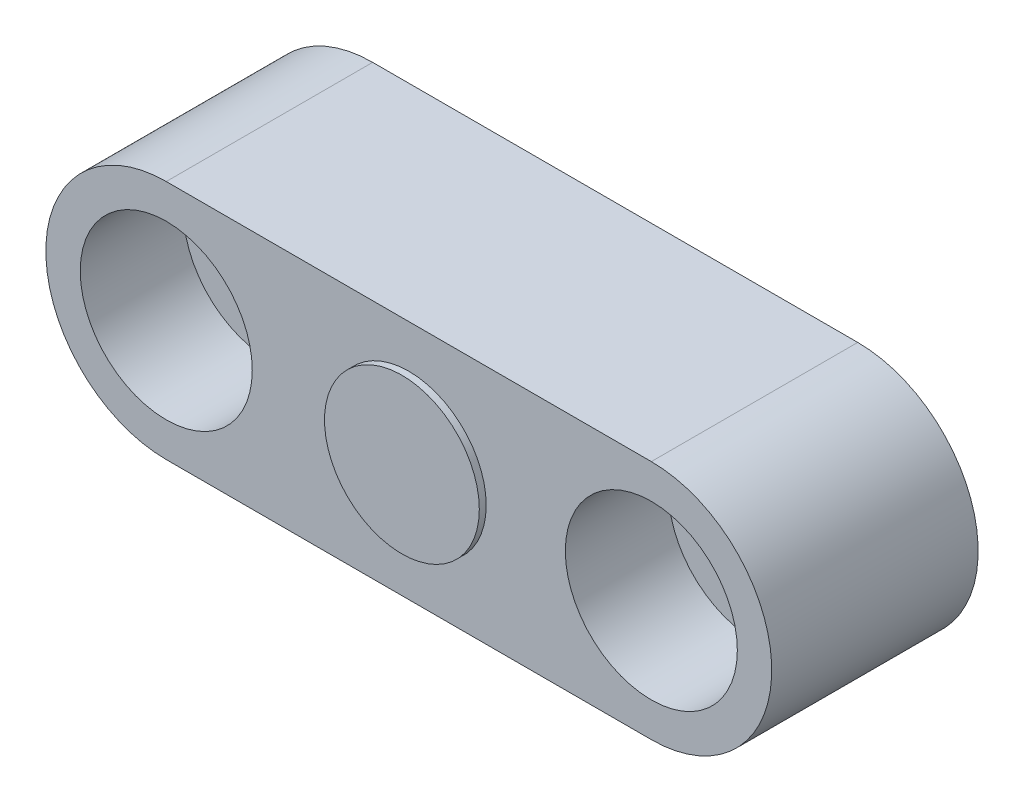
ISO-10303-21;
HEADER;
FILE_DESCRIPTION(('STEP AP214'),'2;1');
FILE_NAME('part.step','',(''),(''),'','','');
FILE_SCHEMA(('AUTOMOTIVE_DESIGN { 1 0 10303 214 1 1 1 1 }'));
ENDSEC;
DATA;
#1=APPLICATION_CONTEXT('core data for automotive mechanical design processes');
#2=APPLICATION_PROTOCOL_DEFINITION('international standard','automotive_design',2000,#1);
#3=PRODUCT_CONTEXT('',#1,'mechanical');
#4=PRODUCT('Part','Part','',(#3));
#5=PRODUCT_RELATED_PRODUCT_CATEGORY('part','',(#4));
#6=PRODUCT_DEFINITION_FORMATION('','',#4);
#7=PRODUCT_DEFINITION_CONTEXT('part definition',#1,'design');
#8=PRODUCT_DEFINITION('design','',#6,#7);
#9=PRODUCT_DEFINITION_SHAPE('','',#8);
#10=(LENGTH_UNIT() NAMED_UNIT(*) SI_UNIT(.MILLI.,.METRE.));
#11=(NAMED_UNIT(*) PLANE_ANGLE_UNIT() SI_UNIT($,.RADIAN.));
#12=(NAMED_UNIT(*) SI_UNIT($,.STERADIAN.) SOLID_ANGLE_UNIT());
#13=UNCERTAINTY_MEASURE_WITH_UNIT(LENGTH_MEASURE(1.E-05),#10,'distance_accuracy_value','');
#14=(GEOMETRIC_REPRESENTATION_CONTEXT(3) GLOBAL_UNCERTAINTY_ASSIGNED_CONTEXT((#13)) GLOBAL_UNIT_ASSIGNED_CONTEXT((#10,
#11,#12)) REPRESENTATION_CONTEXT('',''));
#15=CARTESIAN_POINT('',(0.,0.,0.));
#16=DIRECTION('',(0.,0.,1.));
#17=DIRECTION('',(1.,0.,0.));
#18=AXIS2_PLACEMENT_3D('',#15,#16,#17);
#19=CARTESIAN_POINT('',(7.05,0.,0.));
#20=DIRECTION('',(0.,0.,-1.));
#21=DIRECTION('',(-1.,0.,0.));
#22=AXIS2_PLACEMENT_3D('',#19,#20,#21);
#23=PLANE('',#22);
#24=CARTESIAN_POINT('',(-7.05,0.,0.));
#25=DIRECTION('',(0.,0.,1.));
#26=DIRECTION('',(-1.,0.,0.));
#27=AXIS2_PLACEMENT_3D('',#24,#25,#26);
#28=CIRCLE('',#27,3.17759916969509);
#29=CARTESIAN_POINT('',(-5.45794582904759,-2.75,0.));
#30=VERTEX_POINT('',#29);
#31=CARTESIAN_POINT('',(-5.45794582904759,2.75,0.));
#32=VERTEX_POINT('',#31);
#33=EDGE_CURVE('E51',#30,#32,#28,.T.);
#34=ORIENTED_EDGE('',*,*,#33,.F.);
#35=DIRECTION('',(-1.,0.,0.));
#36=VECTOR('',#35,1.);
#37=CARTESIAN_POINT('',(5.45794582904759,-2.75,0.));
#38=LINE('',#37,#36);
#39=CARTESIAN_POINT('',(5.45794582904759,-2.75,0.));
#40=VERTEX_POINT('',#39);
#41=EDGE_CURVE('E133',#40,#30,#38,.T.);
#42=ORIENTED_EDGE('',*,*,#41,.F.);
#43=CARTESIAN_POINT('',(7.05,0.,0.));
#44=DIRECTION('',(0.,0.,1.));
#45=DIRECTION('',(1.,0.,0.));
#46=AXIS2_PLACEMENT_3D('',#43,#44,#45);
#47=CIRCLE('',#46,3.17759916969509);
#48=CARTESIAN_POINT('',(5.45794582904759,2.75,0.));
#49=VERTEX_POINT('',#48);
#50=EDGE_CURVE('E117',#49,#40,#47,.T.);
#51=ORIENTED_EDGE('',*,*,#50,.F.);
#52=DIRECTION('',(1.,0.,0.));
#53=VECTOR('',#52,1.);
#54=CARTESIAN_POINT('',(5.45794582904759,2.75,0.));
#55=LINE('',#54,#53);
#56=EDGE_CURVE('E127',#32,#49,#55,.T.);
#57=ORIENTED_EDGE('',*,*,#56,.F.);
#58=EDGE_LOOP('',(#34,#42,#51,#57));
#59=FACE_BOUND('',#58,.T.);
#60=CARTESIAN_POINT('',(7.05,0.,0.));
#61=DIRECTION('',(0.,0.,1.));
#62=DIRECTION('',(-1.,0.,0.));
#63=AXIS2_PLACEMENT_3D('',#60,#61,#62);
#64=CIRCLE('',#63,3.49999999999994);
#65=CARTESIAN_POINT('',(7.05,-3.49999999999991,0.));
#66=VERTEX_POINT('',#65);
#67=CARTESIAN_POINT('',(7.05,3.49999999999998,0.));
#68=VERTEX_POINT('',#67);
#69=EDGE_CURVE('E179',#66,#68,#64,.T.);
#70=ORIENTED_EDGE('',*,*,#69,.F.);
#71=DIRECTION('',(1.,0.,0.));
#72=VECTOR('',#71,1.);
#73=CARTESIAN_POINT('',(7.05,-3.49999999999991,0.));
#74=LINE('',#73,#72);
#75=CARTESIAN_POINT('',(-7.05,-3.49999999999991,0.));
#76=VERTEX_POINT('',#75);
#77=EDGE_CURVE('E81',#76,#66,#74,.T.);
#78=ORIENTED_EDGE('',*,*,#77,.F.);
#79=CARTESIAN_POINT('',(-7.05,0.,0.));
#80=DIRECTION('',(0.,0.,1.));
#81=DIRECTION('',(1.,0.,0.));
#82=AXIS2_PLACEMENT_3D('',#79,#80,#81);
#83=CIRCLE('',#82,3.49999999999994);
#84=CARTESIAN_POINT('',(-7.05,3.49999999999994,0.));
#85=VERTEX_POINT('',#84);
#86=EDGE_CURVE('E193',#85,#76,#83,.T.);
#87=ORIENTED_EDGE('',*,*,#86,.F.);
#88=DIRECTION('',(-1.,0.,0.));
#89=VECTOR('',#88,1.);
#90=CARTESIAN_POINT('',(-7.05,3.49999999999998,0.));
#91=LINE('',#90,#89);
#92=EDGE_CURVE('E191',#68,#85,#91,.T.);
#93=ORIENTED_EDGE('',*,*,#92,.F.);
#94=EDGE_LOOP('',(#70,#78,#87,#93));
#95=FACE_BOUND('',#94,.T.);
#96=CARTESIAN_POINT('',(7.05,0.,0.));
#97=DIRECTION('',(0.,0.,-1.));
#98=DIRECTION('',(-1.,0.,0.));
#99=AXIS2_PLACEMENT_3D('',#96,#97,#98);
#100=CIRCLE('',#99,2.5);
#101=CARTESIAN_POINT('',(4.55,0.,0.));
#102=VERTEX_POINT('',#101);
#103=EDGE_CURVE('E166',#102,#102,#100,.T.);
#104=ORIENTED_EDGE('',*,*,#103,.F.);
#105=EDGE_LOOP('',(#104));
#106=FACE_BOUND('',#105,.T.);
#107=CARTESIAN_POINT('',(-7.05,0.,0.));
#108=DIRECTION('',(0.,0.,1.));
#109=DIRECTION('',(1.,0.,0.));
#110=AXIS2_PLACEMENT_3D('',#107,#108,#109);
#111=CIRCLE('',#110,2.5);
#112=CARTESIAN_POINT('',(-4.55,0.,0.));
#113=VERTEX_POINT('',#112);
#114=EDGE_CURVE('E148',#113,#113,#111,.T.);
#115=ORIENTED_EDGE('',*,*,#114,.T.);
#116=EDGE_LOOP('',(#115));
#117=FACE_BOUND('',#116,.T.);
#118=ADVANCED_FACE('F36',(#59,#95,#106,#117),#23,.T.);
#119=CARTESIAN_POINT('',(-7.05,0.,0.));
#120=DIRECTION('',(0.,0.,1.));
#121=DIRECTION('',(1.,0.,0.));
#122=AXIS2_PLACEMENT_3D('',#119,#120,#121);
#123=CYLINDRICAL_SURFACE('',#122,1.75);
#124=CARTESIAN_POINT('',(-7.05,0.,3.));
#125=DIRECTION('',(0.,0.,-1.));
#126=DIRECTION('',(-1.,0.,0.));
#127=AXIS2_PLACEMENT_3D('',#124,#125,#126);
#128=CIRCLE('',#127,1.75);
#129=CARTESIAN_POINT('',(-8.8,0.,3.));
#130=VERTEX_POINT('',#129);
#131=EDGE_CURVE('E152',#130,#130,#128,.T.);
#132=ORIENTED_EDGE('',*,*,#131,.F.);
#133=EDGE_LOOP('',(#132));
#134=FACE_BOUND('',#133,.T.);
#135=CARTESIAN_POINT('',(-7.05,0.,2.));
#136=DIRECTION('',(0.,0.,1.));
#137=DIRECTION('',(1.,0.,0.));
#138=AXIS2_PLACEMENT_3D('',#135,#136,#137);
#139=CIRCLE('',#138,1.75);
#140=CARTESIAN_POINT('',(-5.3,0.,2.));
#141=VERTEX_POINT('',#140);
#142=EDGE_CURVE('E144',#141,#141,#139,.T.);
#143=ORIENTED_EDGE('',*,*,#142,.F.);
#144=EDGE_LOOP('',(#143));
#145=FACE_BOUND('',#144,.T.);
#146=ADVANCED_FACE('F230',(#134,#145),#123,.F.);
#147=CARTESIAN_POINT('',(7.05,0.,0.));
#148=DIRECTION('',(0.,0.,1.));
#149=DIRECTION('',(1.,0.,0.));
#150=AXIS2_PLACEMENT_3D('',#147,#148,#149);
#151=CYLINDRICAL_SURFACE('',#150,1.75);
#152=CARTESIAN_POINT('',(7.05,0.,3.));
#153=DIRECTION('',(0.,0.,1.));
#154=DIRECTION('',(1.,0.,0.));
#155=AXIS2_PLACEMENT_3D('',#152,#153,#154);
#156=CIRCLE('',#155,1.75);
#157=CARTESIAN_POINT('',(8.8,0.,3.));
#158=VERTEX_POINT('',#157);
#159=EDGE_CURVE('E170',#158,#158,#156,.T.);
#160=ORIENTED_EDGE('',*,*,#159,.T.);
#161=EDGE_LOOP('',(#160));
#162=FACE_BOUND('',#161,.T.);
#163=CARTESIAN_POINT('',(7.05,0.,2.));
#164=DIRECTION('',(0.,0.,-1.));
#165=DIRECTION('',(-1.,0.,0.));
#166=AXIS2_PLACEMENT_3D('',#163,#164,#165);
#167=CIRCLE('',#166,1.75);
#168=CARTESIAN_POINT('',(5.3,0.,2.));
#169=VERTEX_POINT('',#168);
#170=EDGE_CURVE('E161',#169,#169,#167,.T.);
#171=ORIENTED_EDGE('',*,*,#170,.T.);
#172=EDGE_LOOP('',(#171));
#173=FACE_BOUND('',#172,.T.);
#174=ADVANCED_FACE('F234',(#162,#173),#151,.F.);
#175=CARTESIAN_POINT('',(7.05,0.,6.));
#176=DIRECTION('',(0.,0.,-1.));
#177=DIRECTION('',(-1.,0.,0.));
#178=AXIS2_PLACEMENT_3D('',#175,#176,#177);
#179=CYLINDRICAL_SURFACE('',#178,3.49999999999994);
#180=ORIENTED_EDGE('',*,*,#69,.T.);
#181=DIRECTION('',(0.,0.,-1.));
#182=VECTOR('',#181,1.);
#183=CARTESIAN_POINT('',(7.05,3.49999999999998,6.));
#184=LINE('',#183,#182);
#185=CARTESIAN_POINT('',(7.05,3.49999999999998,6.));
#186=VERTEX_POINT('',#185);
#187=EDGE_CURVE('E44',#186,#68,#184,.T.);
#188=ORIENTED_EDGE('',*,*,#187,.F.);
#189=CARTESIAN_POINT('',(7.05,0.,6.));
#190=DIRECTION('',(0.,0.,1.));
#191=DIRECTION('',(-1.,0.,0.));
#192=AXIS2_PLACEMENT_3D('',#189,#190,#191);
#193=CIRCLE('',#192,3.49999999999994);
#194=CARTESIAN_POINT('',(7.05,-3.49999999999991,6.));
#195=VERTEX_POINT('',#194);
#196=EDGE_CURVE('E182',#195,#186,#193,.T.);
#197=ORIENTED_EDGE('',*,*,#196,.F.);
#198=DIRECTION('',(0.,0.,-1.));
#199=VECTOR('',#198,1.);
#200=CARTESIAN_POINT('',(7.05,-3.49999999999991,6.));
#201=LINE('',#200,#199);
#202=EDGE_CURVE('E188',#195,#66,#201,.T.);
#203=ORIENTED_EDGE('',*,*,#202,.T.);
#204=EDGE_LOOP('',(#180,#188,#197,#203));
#205=FACE_BOUND('',#204,.T.);
#206=ADVANCED_FACE('F38',(#205),#179,.T.);
#207=CARTESIAN_POINT('',(-7.05,3.49999999999998,6.));
#208=DIRECTION('',(0.,-1.,0.));
#209=DIRECTION('',(0.,0.,-1.));
#210=AXIS2_PLACEMENT_3D('',#207,#208,#209);
#211=PLANE('',#210);
#212=ORIENTED_EDGE('',*,*,#92,.T.);
#213=DIRECTION('',(0.,0.,-1.));
#214=VECTOR('',#213,1.);
#215=CARTESIAN_POINT('',(-7.05,3.49999999999994,6.));
#216=LINE('',#215,#214);
#217=CARTESIAN_POINT('',(-7.05,3.49999999999994,6.));
#218=VERTEX_POINT('',#217);
#219=EDGE_CURVE('E199',#218,#85,#216,.T.);
#220=ORIENTED_EDGE('',*,*,#219,.F.);
#221=DIRECTION('',(-1.,0.,0.));
#222=VECTOR('',#221,1.);
#223=CARTESIAN_POINT('',(-7.05,3.49999999999998,6.));
#224=LINE('',#223,#222);
#225=EDGE_CURVE('E89',#186,#218,#224,.T.);
#226=ORIENTED_EDGE('',*,*,#225,.F.);
#227=ORIENTED_EDGE('',*,*,#187,.T.);
#228=EDGE_LOOP('',(#212,#220,#226,#227));
#229=FACE_BOUND('',#228,.T.);
#230=ADVANCED_FACE('F202',(#229),#211,.F.);
#231=CARTESIAN_POINT('',(-7.05,0.,6.));
#232=DIRECTION('',(0.,0.,-1.));
#233=DIRECTION('',(-1.,0.,0.));
#234=AXIS2_PLACEMENT_3D('',#231,#232,#233);
#235=CYLINDRICAL_SURFACE('',#234,3.49999999999994);
#236=ORIENTED_EDGE('',*,*,#86,.T.);
#237=DIRECTION('',(0.,0.,-1.));
#238=VECTOR('',#237,1.);
#239=CARTESIAN_POINT('',(-7.05,-3.49999999999991,6.));
#240=LINE('',#239,#238);
#241=CARTESIAN_POINT('',(-7.05,-3.49999999999991,6.));
#242=VERTEX_POINT('',#241);
#243=EDGE_CURVE('E197',#242,#76,#240,.T.);
#244=ORIENTED_EDGE('',*,*,#243,.F.);
#245=CARTESIAN_POINT('',(-7.05,0.,6.));
#246=DIRECTION('',(0.,0.,1.));
#247=DIRECTION('',(1.,0.,0.));
#248=AXIS2_PLACEMENT_3D('',#245,#246,#247);
#249=CIRCLE('',#248,3.49999999999994);
#250=EDGE_CURVE('E185',#218,#242,#249,.T.);
#251=ORIENTED_EDGE('',*,*,#250,.F.);
#252=ORIENTED_EDGE('',*,*,#219,.T.);
#253=EDGE_LOOP('',(#236,#244,#251,#252));
#254=FACE_BOUND('',#253,.T.);
#255=ADVANCED_FACE('F210',(#254),#235,.T.);
#256=CARTESIAN_POINT('',(7.05,-3.49999999999991,6.));
#257=DIRECTION('',(0.,1.,0.));
#258=DIRECTION('',(0.,0.,1.));
#259=AXIS2_PLACEMENT_3D('',#256,#257,#258);
#260=PLANE('',#259);
#261=ORIENTED_EDGE('',*,*,#77,.T.);
#262=ORIENTED_EDGE('',*,*,#202,.F.);
#263=DIRECTION('',(1.,0.,0.));
#264=VECTOR('',#263,1.);
#265=CARTESIAN_POINT('',(7.05,-3.49999999999991,6.));
#266=LINE('',#265,#264);
#267=EDGE_CURVE('E60',#242,#195,#266,.T.);
#268=ORIENTED_EDGE('',*,*,#267,.F.);
#269=ORIENTED_EDGE('',*,*,#243,.T.);
#270=EDGE_LOOP('',(#261,#262,#268,#269));
#271=FACE_BOUND('',#270,.T.);
#272=ADVANCED_FACE('F212',(#271),#260,.F.);
#273=CARTESIAN_POINT('',(7.05,0.,6.));
#274=DIRECTION('',(0.,0.,-1.));
#275=DIRECTION('',(-1.,0.,0.));
#276=AXIS2_PLACEMENT_3D('',#273,#274,#275);
#277=PLANE('',#276);
#278=CARTESIAN_POINT('',(0.,0.,6.));
#279=DIRECTION('',(0.,0.,-1.));
#280=DIRECTION('',(-1.,0.,0.));
#281=AXIS2_PLACEMENT_3D('',#278,#279,#280);
#282=CIRCLE('',#281,2.25);
#283=CARTESIAN_POINT('',(-2.25,0.,6.));
#284=VERTEX_POINT('',#283);
#285=EDGE_CURVE('E422',#284,#284,#282,.T.);
#286=ORIENTED_EDGE('',*,*,#285,.T.);
#287=EDGE_LOOP('',(#286));
#288=FACE_BOUND('',#287,.T.);
#289=CARTESIAN_POINT('',(-7.05,0.,6.));
#290=DIRECTION('',(0.,0.,-1.));
#291=DIRECTION('',(-1.,0.,0.));
#292=AXIS2_PLACEMENT_3D('',#289,#290,#291);
#293=CIRCLE('',#292,2.5);
#294=CARTESIAN_POINT('',(-9.55,0.,6.));
#295=VERTEX_POINT('',#294);
#296=EDGE_CURVE('E157',#295,#295,#293,.T.);
#297=ORIENTED_EDGE('',*,*,#296,.T.);
#298=EDGE_LOOP('',(#297));
#299=FACE_BOUND('',#298,.T.);
#300=CARTESIAN_POINT('',(7.05,0.,6.));
#301=DIRECTION('',(0.,0.,1.));
#302=DIRECTION('',(1.,0.,0.));
#303=AXIS2_PLACEMENT_3D('',#300,#301,#302);
#304=CIRCLE('',#303,2.5);
#305=CARTESIAN_POINT('',(9.55,0.,6.));
#306=VERTEX_POINT('',#305);
#307=EDGE_CURVE('E175',#306,#306,#304,.T.);
#308=ORIENTED_EDGE('',*,*,#307,.F.);
#309=EDGE_LOOP('',(#308));
#310=FACE_BOUND('',#309,.T.);
#311=ORIENTED_EDGE('',*,*,#196,.T.);
#312=ORIENTED_EDGE('',*,*,#225,.T.);
#313=ORIENTED_EDGE('',*,*,#250,.T.);
#314=ORIENTED_EDGE('',*,*,#267,.T.);
#315=EDGE_LOOP('',(#311,#312,#313,#314));
#316=FACE_BOUND('',#315,.T.);
#317=ADVANCED_FACE('F213',(#288,#299,#310,#316),#277,.F.);
#318=CARTESIAN_POINT('',(7.05,0.,3.));
#319=DIRECTION('',(0.,0.,1.));
#320=DIRECTION('',(1.,0.,0.));
#321=AXIS2_PLACEMENT_3D('',#318,#319,#320);
#322=CYLINDRICAL_SURFACE('',#321,2.5);
#323=CARTESIAN_POINT('',(7.05,0.,3.));
#324=DIRECTION('',(0.,0.,1.));
#325=DIRECTION('',(1.,0.,0.));
#326=AXIS2_PLACEMENT_3D('',#323,#324,#325);
#327=CIRCLE('',#326,2.5);
#328=CARTESIAN_POINT('',(9.55,0.,3.));
#329=VERTEX_POINT('',#328);
#330=EDGE_CURVE('E176',#329,#329,#327,.T.);
#331=ORIENTED_EDGE('',*,*,#330,.F.);
#332=EDGE_LOOP('',(#331));
#333=FACE_BOUND('',#332,.T.);
#334=ORIENTED_EDGE('',*,*,#307,.T.);
#335=EDGE_LOOP('',(#334));
#336=FACE_BOUND('',#335,.T.);
#337=ADVANCED_FACE('F215',(#333,#336),#322,.F.);
#338=CARTESIAN_POINT('',(7.05,0.,3.));
#339=DIRECTION('',(0.,0.,1.));
#340=DIRECTION('',(1.,0.,0.));
#341=AXIS2_PLACEMENT_3D('',#338,#339,#340);
#342=PLANE('',#341);
#343=ORIENTED_EDGE('',*,*,#159,.F.);
#344=EDGE_LOOP('',(#343));
#345=FACE_BOUND('',#344,.T.);
#346=ORIENTED_EDGE('',*,*,#330,.T.);
#347=EDGE_LOOP('',(#346));
#348=FACE_BOUND('',#347,.T.);
#349=ADVANCED_FACE('F222',(#345,#348),#342,.T.);
#350=CARTESIAN_POINT('',(7.05,0.,2.));
#351=DIRECTION('',(0.,0.,-1.));
#352=DIRECTION('',(-1.,0.,0.));
#353=AXIS2_PLACEMENT_3D('',#350,#351,#352);
#354=CYLINDRICAL_SURFACE('',#353,2.5);
#355=CARTESIAN_POINT('',(7.05,0.,2.));
#356=DIRECTION('',(0.,0.,-1.));
#357=DIRECTION('',(-1.,0.,0.));
#358=AXIS2_PLACEMENT_3D('',#355,#356,#357);
#359=CIRCLE('',#358,2.5);
#360=CARTESIAN_POINT('',(4.55,0.,2.));
#361=VERTEX_POINT('',#360);
#362=EDGE_CURVE('E167',#361,#361,#359,.T.);
#363=ORIENTED_EDGE('',*,*,#362,.F.);
#364=EDGE_LOOP('',(#363));
#365=FACE_BOUND('',#364,.T.);
#366=ORIENTED_EDGE('',*,*,#103,.T.);
#367=EDGE_LOOP('',(#366));
#368=FACE_BOUND('',#367,.T.);
#369=ADVANCED_FACE('F253',(#365,#368),#354,.F.);
#370=CARTESIAN_POINT('',(7.05,0.,2.));
#371=DIRECTION('',(0.,0.,-1.));
#372=DIRECTION('',(-1.,0.,0.));
#373=AXIS2_PLACEMENT_3D('',#370,#371,#372);
#374=PLANE('',#373);
#375=ORIENTED_EDGE('',*,*,#170,.F.);
#376=EDGE_LOOP('',(#375));
#377=FACE_BOUND('',#376,.T.);
#378=ORIENTED_EDGE('',*,*,#362,.T.);
#379=EDGE_LOOP('',(#378));
#380=FACE_BOUND('',#379,.T.);
#381=ADVANCED_FACE('F260',(#377,#380),#374,.T.);
#382=CARTESIAN_POINT('',(-7.05,0.,3.));
#383=DIRECTION('',(0.,0.,1.));
#384=DIRECTION('',(1.,0.,0.));
#385=AXIS2_PLACEMENT_3D('',#382,#383,#384);
#386=CYLINDRICAL_SURFACE('',#385,2.5);
#387=CARTESIAN_POINT('',(-7.05,0.,3.));
#388=DIRECTION('',(0.,0.,-1.));
#389=DIRECTION('',(-1.,0.,0.));
#390=AXIS2_PLACEMENT_3D('',#387,#388,#389);
#391=CIRCLE('',#390,2.5);
#392=CARTESIAN_POINT('',(-9.55,0.,3.));
#393=VERTEX_POINT('',#392);
#394=EDGE_CURVE('E158',#393,#393,#391,.T.);
#395=ORIENTED_EDGE('',*,*,#394,.T.);
#396=EDGE_LOOP('',(#395));
#397=FACE_BOUND('',#396,.T.);
#398=ORIENTED_EDGE('',*,*,#296,.F.);
#399=EDGE_LOOP('',(#398));
#400=FACE_BOUND('',#399,.T.);
#401=ADVANCED_FACE('F271',(#397,#400),#386,.F.);
#402=CARTESIAN_POINT('',(-7.05,0.,3.));
#403=DIRECTION('',(0.,0.,1.));
#404=DIRECTION('',(-1.,0.,0.));
#405=AXIS2_PLACEMENT_3D('',#402,#403,#404);
#406=PLANE('',#405);
#407=ORIENTED_EDGE('',*,*,#131,.T.);
#408=EDGE_LOOP('',(#407));
#409=FACE_BOUND('',#408,.T.);
#410=ORIENTED_EDGE('',*,*,#394,.F.);
#411=EDGE_LOOP('',(#410));
#412=FACE_BOUND('',#411,.T.);
#413=ADVANCED_FACE('F291',(#409,#412),#406,.T.);
#414=CARTESIAN_POINT('',(-7.05,0.,2.));
#415=DIRECTION('',(0.,0.,-1.));
#416=DIRECTION('',(1.,0.,0.));
#417=AXIS2_PLACEMENT_3D('',#414,#415,#416);
#418=PLANE('',#417);
#419=CARTESIAN_POINT('',(-7.05,0.,2.));
#420=DIRECTION('',(0.,0.,1.));
#421=DIRECTION('',(1.,0.,0.));
#422=AXIS2_PLACEMENT_3D('',#419,#420,#421);
#423=CIRCLE('',#422,2.5);
#424=CARTESIAN_POINT('',(-4.55,0.,2.));
#425=VERTEX_POINT('',#424);
#426=EDGE_CURVE('E149',#425,#425,#423,.T.);
#427=ORIENTED_EDGE('',*,*,#426,.F.);
#428=EDGE_LOOP('',(#427));
#429=FACE_BOUND('',#428,.T.);
#430=ORIENTED_EDGE('',*,*,#142,.T.);
#431=EDGE_LOOP('',(#430));
#432=FACE_BOUND('',#431,.T.);
#433=ADVANCED_FACE('F282',(#429,#432),#418,.T.);
#434=CARTESIAN_POINT('',(-7.05,0.,2.));
#435=DIRECTION('',(0.,0.,-1.));
#436=DIRECTION('',(-1.,0.,0.));
#437=AXIS2_PLACEMENT_3D('',#434,#435,#436);
#438=CYLINDRICAL_SURFACE('',#437,2.5);
#439=ORIENTED_EDGE('',*,*,#426,.T.);
#440=EDGE_LOOP('',(#439));
#441=FACE_BOUND('',#440,.T.);
#442=ORIENTED_EDGE('',*,*,#114,.F.);
#443=EDGE_LOOP('',(#442));
#444=FACE_BOUND('',#443,.T.);
#445=ADVANCED_FACE('F279',(#441,#444),#438,.F.);
#446=CARTESIAN_POINT('',(-7.05,0.,18.2232029636782));
#447=DIRECTION('',(0.,0.,-1.));
#448=DIRECTION('',(-1.,0.,0.));
#449=AXIS2_PLACEMENT_3D('',#446,#447,#448);
#450=CYLINDRICAL_SURFACE('',#449,3.17759916969509);
#451=CARTESIAN_POINT('',(-7.05,0.,5.));
#452=DIRECTION('',(0.,0.,-1.));
#453=DIRECTION('',(-1.,0.,0.));
#454=AXIS2_PLACEMENT_3D('',#451,#452,#453);
#455=CIRCLE('',#454,3.17759916969509);
#456=CARTESIAN_POINT('',(-5.45794582904759,2.75,5.));
#457=VERTEX_POINT('',#456);
#458=CARTESIAN_POINT('',(-5.45794582904759,-2.75,5.));
#459=VERTEX_POINT('',#458);
#460=EDGE_CURVE('E145',#457,#459,#455,.T.);
#461=ORIENTED_EDGE('',*,*,#460,.T.);
#462=DIRECTION('',(0.,0.,-1.));
#463=VECTOR('',#462,1.);
#464=CARTESIAN_POINT('',(-5.45794582904759,-2.75,18.2232029636782));
#465=LINE('',#464,#463);
#466=EDGE_CURVE('E138',#459,#30,#465,.T.);
#467=ORIENTED_EDGE('',*,*,#466,.T.);
#468=ORIENTED_EDGE('',*,*,#33,.T.);
#469=DIRECTION('',(0.,0.,-1.));
#470=VECTOR('',#469,1.);
#471=CARTESIAN_POINT('',(-5.45794582904759,2.75,18.2232029636782));
#472=LINE('',#471,#470);
#473=EDGE_CURVE('E124',#457,#32,#472,.T.);
#474=ORIENTED_EDGE('',*,*,#473,.F.);
#475=EDGE_LOOP('',(#461,#467,#468,#474));
#476=FACE_BOUND('',#475,.T.);
#477=ADVANCED_FACE('F281',(#476),#450,.T.);
#478=CARTESIAN_POINT('',(5.45794582904759,-2.75,18.2232029636782));
#479=DIRECTION('',(0.,-1.,0.));
#480=DIRECTION('',(1.,0.,0.));
#481=AXIS2_PLACEMENT_3D('',#478,#479,#480);
#482=PLANE('',#481);
#483=DIRECTION('',(1.,0.,0.));
#484=VECTOR('',#483,1.);
#485=CARTESIAN_POINT('',(5.45794582904759,-2.75,5.));
#486=LINE('',#485,#484);
#487=CARTESIAN_POINT('',(5.45794582904759,-2.75,5.));
#488=VERTEX_POINT('',#487);
#489=EDGE_CURVE('E427',#459,#488,#486,.T.);
#490=ORIENTED_EDGE('',*,*,#489,.T.);
#491=DIRECTION('',(0.,0.,-1.));
#492=VECTOR('',#491,1.);
#493=CARTESIAN_POINT('',(5.45794582904759,-2.75,18.2232029636782));
#494=LINE('',#493,#492);
#495=EDGE_CURVE('E123',#488,#40,#494,.T.);
#496=ORIENTED_EDGE('',*,*,#495,.T.);
#497=ORIENTED_EDGE('',*,*,#41,.T.);
#498=ORIENTED_EDGE('',*,*,#466,.F.);
#499=EDGE_LOOP('',(#490,#496,#497,#498));
#500=FACE_BOUND('',#499,.T.);
#501=ADVANCED_FACE('F289',(#500),#482,.F.);
#502=CARTESIAN_POINT('',(7.05,0.,18.2232029636782));
#503=DIRECTION('',(0.,0.,-1.));
#504=DIRECTION('',(-1.,0.,0.));
#505=AXIS2_PLACEMENT_3D('',#502,#503,#504);
#506=CYLINDRICAL_SURFACE('',#505,3.17759916969509);
#507=CARTESIAN_POINT('',(7.05,0.,5.));
#508=DIRECTION('',(0.,0.,-1.));
#509=DIRECTION('',(-1.,0.,0.));
#510=AXIS2_PLACEMENT_3D('',#507,#508,#509);
#511=CIRCLE('',#510,3.17759916969509);
#512=CARTESIAN_POINT('',(5.45794582904759,2.75,5.));
#513=VERTEX_POINT('',#512);
#514=EDGE_CURVE('E120',#488,#513,#511,.T.);
#515=ORIENTED_EDGE('',*,*,#514,.T.);
#516=DIRECTION('',(0.,0.,-1.));
#517=VECTOR('',#516,1.);
#518=CARTESIAN_POINT('',(5.45794582904759,2.75,18.2232029636782));
#519=LINE('',#518,#517);
#520=EDGE_CURVE('E112',#513,#49,#519,.T.);
#521=ORIENTED_EDGE('',*,*,#520,.T.);
#522=ORIENTED_EDGE('',*,*,#50,.T.);
#523=ORIENTED_EDGE('',*,*,#495,.F.);
#524=EDGE_LOOP('',(#515,#521,#522,#523));
#525=FACE_BOUND('',#524,.T.);
#526=ADVANCED_FACE('F114',(#525),#506,.T.);
#527=CARTESIAN_POINT('',(5.45794582904759,2.75,18.2232029636782));
#528=DIRECTION('',(0.,1.,0.));
#529=DIRECTION('',(-1.,0.,0.));
#530=AXIS2_PLACEMENT_3D('',#527,#528,#529);
#531=PLANE('',#530);
#532=DIRECTION('',(-1.,0.,0.));
#533=VECTOR('',#532,1.);
#534=CARTESIAN_POINT('',(5.45794582904759,2.75,5.));
#535=LINE('',#534,#533);
#536=EDGE_CURVE('E142',#513,#457,#535,.T.);
#537=ORIENTED_EDGE('',*,*,#536,.T.);
#538=ORIENTED_EDGE('',*,*,#473,.T.);
#539=ORIENTED_EDGE('',*,*,#56,.T.);
#540=ORIENTED_EDGE('',*,*,#520,.F.);
#541=EDGE_LOOP('',(#537,#538,#539,#540));
#542=FACE_BOUND('',#541,.T.);
#543=ADVANCED_FACE('F128',(#542),#531,.F.);
#544=CARTESIAN_POINT('',(7.05,0.,5.));
#545=DIRECTION('',(0.,0.,-1.));
#546=DIRECTION('',(-1.,0.,0.));
#547=AXIS2_PLACEMENT_3D('',#544,#545,#546);
#548=PLANE('',#547);
#549=CARTESIAN_POINT('',(0.,0.,5.));
#550=DIRECTION('',(0.,0.,-1.));
#551=DIRECTION('',(-1.,0.,0.));
#552=AXIS2_PLACEMENT_3D('',#549,#550,#551);
#553=CIRCLE('',#552,2.25);
#554=CARTESIAN_POINT('',(-2.25,0.,5.));
#555=VERTEX_POINT('',#554);
#556=EDGE_CURVE('E12',#555,#555,#553,.T.);
#557=ORIENTED_EDGE('',*,*,#556,.F.);
#558=EDGE_LOOP('',(#557));
#559=FACE_BOUND('',#558,.T.);
#560=ORIENTED_EDGE('',*,*,#460,.F.);
#561=ORIENTED_EDGE('',*,*,#536,.F.);
#562=ORIENTED_EDGE('',*,*,#514,.F.);
#563=ORIENTED_EDGE('',*,*,#489,.F.);
#564=EDGE_LOOP('',(#560,#561,#562,#563));
#565=FACE_BOUND('',#564,.T.);
#566=ADVANCED_FACE('F357',(#559,#565),#548,.T.);
#567=CARTESIAN_POINT('',(0.,0.,4.8));
#568=DIRECTION('',(0.,0.,1.));
#569=DIRECTION('',(1.,0.,0.));
#570=AXIS2_PLACEMENT_3D('',#567,#568,#569);
#571=PLANE('',#570);
#572=CARTESIAN_POINT('',(0.,0.,4.8));
#573=DIRECTION('',(0.,0.,1.));
#574=DIRECTION('',(1.,0.,0.));
#575=AXIS2_PLACEMENT_3D('',#572,#573,#574);
#576=CIRCLE('',#575,2.25);
#577=CARTESIAN_POINT('',(2.25,0.,4.8));
#578=VERTEX_POINT('',#577);
#579=EDGE_CURVE('E419',#578,#578,#576,.T.);
#580=ORIENTED_EDGE('',*,*,#579,.F.);
#581=EDGE_LOOP('',(#580));
#582=FACE_BOUND('',#581,.T.);
#583=ADVANCED_FACE('F373',(#582),#571,.F.);
#584=CARTESIAN_POINT('',(0.,0.,4.8));
#585=DIRECTION('',(0.,0.,1.));
#586=DIRECTION('',(1.,0.,0.));
#587=AXIS2_PLACEMENT_3D('',#584,#585,#586);
#588=CYLINDRICAL_SURFACE('',#587,2.25);
#589=ORIENTED_EDGE('',*,*,#556,.T.);
#590=EDGE_LOOP('',(#589));
#591=FACE_BOUND('',#590,.T.);
#592=ORIENTED_EDGE('',*,*,#579,.T.);
#593=EDGE_LOOP('',(#592));
#594=FACE_BOUND('',#593,.T.);
#595=ADVANCED_FACE('F383',(#591,#594),#588,.T.);
#596=CARTESIAN_POINT('',(0.,0.,6.2));
#597=DIRECTION('',(0.,0.,1.));
#598=DIRECTION('',(1.,0.,0.));
#599=AXIS2_PLACEMENT_3D('',#596,#597,#598);
#600=CIRCLE('',#599,2.25);
#601=CARTESIAN_POINT('',(2.25,0.,6.2));
#602=VERTEX_POINT('',#601);
#603=EDGE_CURVE('E418',#602,#602,#600,.T.);
#604=ORIENTED_EDGE('',*,*,#603,.F.);
#605=EDGE_LOOP('',(#604));
#606=FACE_BOUND('',#605,.T.);
#607=ORIENTED_EDGE('',*,*,#285,.F.);
#608=EDGE_LOOP('',(#607));
#609=FACE_BOUND('',#608,.T.);
#610=ADVANCED_FACE('F393',(#606,#609),#588,.T.);
#611=CARTESIAN_POINT('',(0.,0.,6.2));
#612=DIRECTION('',(0.,0.,1.));
#613=DIRECTION('',(1.,0.,0.));
#614=AXIS2_PLACEMENT_3D('',#611,#612,#613);
#615=PLANE('',#614);
#616=ORIENTED_EDGE('',*,*,#603,.T.);
#617=EDGE_LOOP('',(#616));
#618=FACE_BOUND('',#617,.T.);
#619=ADVANCED_FACE('F403',(#618),#615,.T.);
#620=CLOSED_SHELL('',(#118,#146,#174,#206,#230,#255,#272,#317,#337,#349,#369,#381,#401,#413,
#433,#445,#477,#501,#526,#543,#566,#583,#595,#610,#619));
#621=MANIFOLD_SOLID_BREP('B2',#620);
#622=ADVANCED_BREP_SHAPE_REPRESENTATION('',(#18,#621),#14);
#623=SHAPE_DEFINITION_REPRESENTATION(#9,#622);
ENDSEC;
END-ISO-10303-21;
